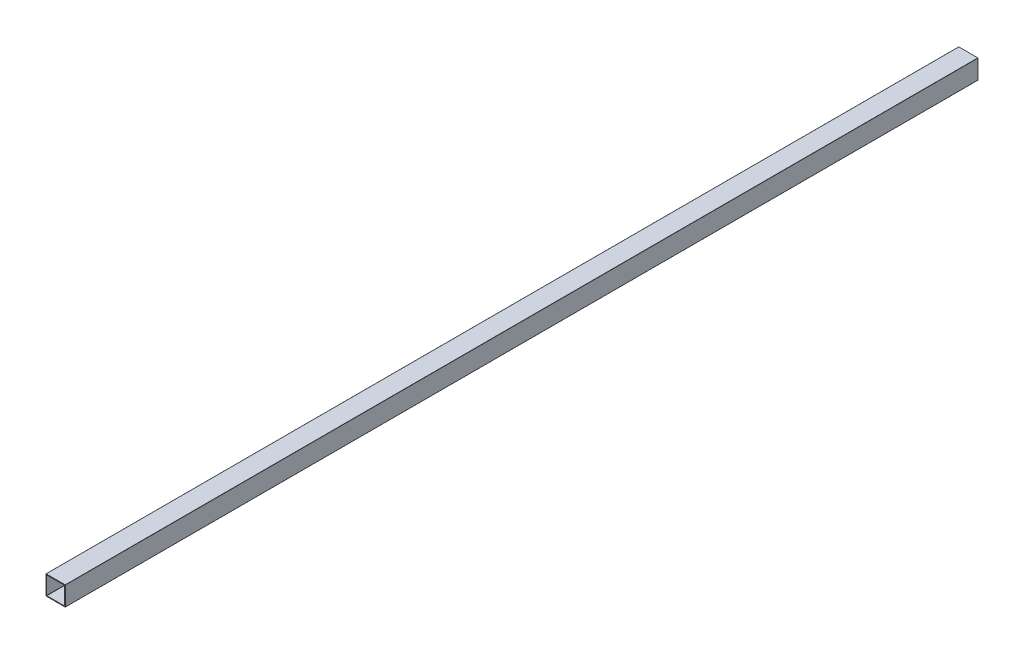
ISO-10303-21;
HEADER;
FILE_DESCRIPTION(('STEP AP214'),'2;1');
FILE_NAME('part.step','',(''),(''),'','','');
FILE_SCHEMA(('AUTOMOTIVE_DESIGN { 1 0 10303 214 1 1 1 1 }'));
ENDSEC;
DATA;
#1=APPLICATION_CONTEXT('core data for automotive mechanical design processes');
#2=APPLICATION_PROTOCOL_DEFINITION('international standard','automotive_design',2000,#1);
#3=PRODUCT_CONTEXT('',#1,'mechanical');
#4=PRODUCT('Part','Part','',(#3));
#5=PRODUCT_RELATED_PRODUCT_CATEGORY('part','',(#4));
#6=PRODUCT_DEFINITION_FORMATION('','',#4);
#7=PRODUCT_DEFINITION_CONTEXT('part definition',#1,'design');
#8=PRODUCT_DEFINITION('design','',#6,#7);
#9=PRODUCT_DEFINITION_SHAPE('','',#8);
#10=(LENGTH_UNIT() NAMED_UNIT(*) SI_UNIT(.MILLI.,.METRE.));
#11=(NAMED_UNIT(*) PLANE_ANGLE_UNIT() SI_UNIT($,.RADIAN.));
#12=(NAMED_UNIT(*) SI_UNIT($,.STERADIAN.) SOLID_ANGLE_UNIT());
#13=UNCERTAINTY_MEASURE_WITH_UNIT(LENGTH_MEASURE(1.E-05),#10,'distance_accuracy_value','');
#14=(GEOMETRIC_REPRESENTATION_CONTEXT(3) GLOBAL_UNCERTAINTY_ASSIGNED_CONTEXT((#13)) GLOBAL_UNIT_ASSIGNED_CONTEXT((#10,
#11,#12)) REPRESENTATION_CONTEXT('',''));
#15=CARTESIAN_POINT('',(0.,0.,0.));
#16=DIRECTION('',(0.,0.,1.));
#17=DIRECTION('',(1.,0.,0.));
#18=AXIS2_PLACEMENT_3D('',#15,#16,#17);
#19=CARTESIAN_POINT('',(63.5,-63.5,-6000.));
#20=DIRECTION('',(1.,0.,0.));
#21=DIRECTION('',(0.,0.,-1.));
#22=AXIS2_PLACEMENT_3D('',#19,#20,#21);
#23=PLANE('',#22);
#24=DIRECTION('',(0.,1.,0.));
#25=VECTOR('',#24,1.);
#26=CARTESIAN_POINT('',(63.5,-63.5,0.));
#27=LINE('',#26,#25);
#28=CARTESIAN_POINT('',(63.5,-62.5,0.));
#29=VERTEX_POINT('',#28);
#30=CARTESIAN_POINT('',(63.5,62.5,0.));
#31=VERTEX_POINT('',#30);
#32=EDGE_CURVE('E197',#29,#31,#27,.T.);
#33=ORIENTED_EDGE('',*,*,#32,.F.);
#34=DIRECTION('',(0.,0.,1.));
#35=VECTOR('',#34,1.);
#36=CARTESIAN_POINT('',(63.5,-62.5,-6000.));
#37=LINE('',#36,#35);
#38=CARTESIAN_POINT('',(63.5,-62.5,-6000.));
#39=VERTEX_POINT('',#38);
#40=EDGE_CURVE('E158',#29,#39,#37,.F.);
#41=ORIENTED_EDGE('',*,*,#40,.T.);
#42=DIRECTION('',(0.,1.,0.));
#43=VECTOR('',#42,1.);
#44=CARTESIAN_POINT('',(63.5,-63.5,-6000.));
#45=LINE('',#44,#43);
#46=CARTESIAN_POINT('',(63.5,62.5,-6000.));
#47=VERTEX_POINT('',#46);
#48=EDGE_CURVE('E185',#39,#47,#45,.T.);
#49=ORIENTED_EDGE('',*,*,#48,.T.);
#50=DIRECTION('',(0.,0.,1.));
#51=VECTOR('',#50,1.);
#52=CARTESIAN_POINT('',(63.5,62.5,-6000.));
#53=LINE('',#52,#51);
#54=EDGE_CURVE('E251',#47,#31,#53,.T.);
#55=ORIENTED_EDGE('',*,*,#54,.T.);
#56=EDGE_LOOP('',(#33,#41,#49,#55));
#57=FACE_BOUND('',#56,.T.);
#58=ADVANCED_FACE('F33',(#57),#23,.T.);
#59=CARTESIAN_POINT('',(-63.5,-63.5,-6000.));
#60=DIRECTION('',(0.,-1.,0.));
#61=DIRECTION('',(0.,0.,-1.));
#62=AXIS2_PLACEMENT_3D('',#59,#60,#61);
#63=PLANE('',#62);
#64=DIRECTION('',(1.,0.,0.));
#65=VECTOR('',#64,1.);
#66=CARTESIAN_POINT('',(-63.5,-63.5,0.));
#67=LINE('',#66,#65);
#68=CARTESIAN_POINT('',(-62.5,-63.5,0.));
#69=VERTEX_POINT('',#68);
#70=CARTESIAN_POINT('',(62.5,-63.5,0.));
#71=VERTEX_POINT('',#70);
#72=EDGE_CURVE('E189',#69,#71,#67,.T.);
#73=ORIENTED_EDGE('',*,*,#72,.F.);
#74=DIRECTION('',(0.,0.,1.));
#75=VECTOR('',#74,1.);
#76=CARTESIAN_POINT('',(-62.5,-63.5,-6000.));
#77=LINE('',#76,#75);
#78=CARTESIAN_POINT('',(-62.5,-63.5,-6000.));
#79=VERTEX_POINT('',#78);
#80=EDGE_CURVE('E238',#69,#79,#77,.F.);
#81=ORIENTED_EDGE('',*,*,#80,.T.);
#82=DIRECTION('',(1.,0.,0.));
#83=VECTOR('',#82,1.);
#84=CARTESIAN_POINT('',(-63.5,-63.5,-6000.));
#85=LINE('',#84,#83);
#86=CARTESIAN_POINT('',(62.5,-63.5,-6000.));
#87=VERTEX_POINT('',#86);
#88=EDGE_CURVE('E194',#79,#87,#85,.T.);
#89=ORIENTED_EDGE('',*,*,#88,.T.);
#90=DIRECTION('',(0.,0.,1.));
#91=VECTOR('',#90,1.);
#92=CARTESIAN_POINT('',(62.5,-63.5,-6000.));
#93=LINE('',#92,#91);
#94=EDGE_CURVE('E235',#87,#71,#93,.T.);
#95=ORIENTED_EDGE('',*,*,#94,.T.);
#96=EDGE_LOOP('',(#73,#81,#89,#95));
#97=FACE_BOUND('',#96,.T.);
#98=ADVANCED_FACE('F305',(#97),#63,.T.);
#99=CARTESIAN_POINT('',(-63.5,-63.5,-6000.));
#100=DIRECTION('',(-1.,0.,0.));
#101=DIRECTION('',(0.,0.,1.));
#102=AXIS2_PLACEMENT_3D('',#99,#100,#101);
#103=PLANE('',#102);
#104=DIRECTION('',(0.,-1.,0.));
#105=VECTOR('',#104,1.);
#106=CARTESIAN_POINT('',(-63.5,-63.5,-6000.));
#107=LINE('',#106,#105);
#108=CARTESIAN_POINT('',(-63.5,62.5,-6000.));
#109=VERTEX_POINT('',#108);
#110=CARTESIAN_POINT('',(-63.5,-62.5,-6000.));
#111=VERTEX_POINT('',#110);
#112=EDGE_CURVE('E191',#109,#111,#107,.T.);
#113=ORIENTED_EDGE('',*,*,#112,.T.);
#114=DIRECTION('',(0.,0.,1.));
#115=VECTOR('',#114,1.);
#116=CARTESIAN_POINT('',(-63.5,-62.5,-6000.));
#117=LINE('',#116,#115);
#118=CARTESIAN_POINT('',(-63.5,-62.5,0.));
#119=VERTEX_POINT('',#118);
#120=EDGE_CURVE('E224',#111,#119,#117,.T.);
#121=ORIENTED_EDGE('',*,*,#120,.T.);
#122=DIRECTION('',(0.,-1.,0.));
#123=VECTOR('',#122,1.);
#124=CARTESIAN_POINT('',(-63.5,-63.5,0.));
#125=LINE('',#124,#123);
#126=CARTESIAN_POINT('',(-63.5,62.5,0.));
#127=VERTEX_POINT('',#126);
#128=EDGE_CURVE('E203',#127,#119,#125,.T.);
#129=ORIENTED_EDGE('',*,*,#128,.F.);
#130=DIRECTION('',(0.,0.,1.));
#131=VECTOR('',#130,1.);
#132=CARTESIAN_POINT('',(-63.5,62.5,-6000.));
#133=LINE('',#132,#131);
#134=EDGE_CURVE('E222',#127,#109,#133,.F.);
#135=ORIENTED_EDGE('',*,*,#134,.T.);
#136=EDGE_LOOP('',(#113,#121,#129,#135));
#137=FACE_BOUND('',#136,.T.);
#138=ADVANCED_FACE('F311',(#137),#103,.T.);
#139=CARTESIAN_POINT('',(-63.5,63.5,-6000.));
#140=DIRECTION('',(0.,1.,0.));
#141=DIRECTION('',(0.,0.,1.));
#142=AXIS2_PLACEMENT_3D('',#139,#140,#141);
#143=PLANE('',#142);
#144=DIRECTION('',(-1.,0.,0.));
#145=VECTOR('',#144,1.);
#146=CARTESIAN_POINT('',(-63.5,63.5,-6000.));
#147=LINE('',#146,#145);
#148=CARTESIAN_POINT('',(62.5,63.5,-6000.));
#149=VERTEX_POINT('',#148);
#150=CARTESIAN_POINT('',(-62.5,63.5,-6000.));
#151=VERTEX_POINT('',#150);
#152=EDGE_CURVE('E188',#149,#151,#147,.T.);
#153=ORIENTED_EDGE('',*,*,#152,.T.);
#154=DIRECTION('',(0.,0.,1.));
#155=VECTOR('',#154,1.);
#156=CARTESIAN_POINT('',(-62.5,63.5,-6000.));
#157=LINE('',#156,#155);
#158=CARTESIAN_POINT('',(-62.5,63.5,0.));
#159=VERTEX_POINT('',#158);
#160=EDGE_CURVE('E248',#151,#159,#157,.T.);
#161=ORIENTED_EDGE('',*,*,#160,.T.);
#162=DIRECTION('',(-1.,0.,0.));
#163=VECTOR('',#162,1.);
#164=CARTESIAN_POINT('',(-63.5,63.5,0.));
#165=LINE('',#164,#163);
#166=CARTESIAN_POINT('',(62.5,63.5,0.));
#167=VERTEX_POINT('',#166);
#168=EDGE_CURVE('E200',#167,#159,#165,.T.);
#169=ORIENTED_EDGE('',*,*,#168,.F.);
#170=DIRECTION('',(0.,0.,1.));
#171=VECTOR('',#170,1.);
#172=CARTESIAN_POINT('',(62.5,63.5,-6000.));
#173=LINE('',#172,#171);
#174=EDGE_CURVE('E55',#167,#149,#173,.F.);
#175=ORIENTED_EDGE('',*,*,#174,.T.);
#176=EDGE_LOOP('',(#153,#161,#169,#175));
#177=FACE_BOUND('',#176,.T.);
#178=ADVANCED_FACE('F316',(#177),#143,.T.);
#179=CARTESIAN_POINT('',(0.,0.,-6000.));
#180=DIRECTION('',(0.,0.,-1.));
#181=DIRECTION('',(-1.,0.,0.));
#182=AXIS2_PLACEMENT_3D('',#179,#180,#181);
#183=PLANE('',#182);
#184=DIRECTION('',(0.,-1.,0.));
#185=VECTOR('',#184,1.);
#186=CARTESIAN_POINT('',(-58.95,-58.95,-6000.));
#187=LINE('',#186,#185);
#188=CARTESIAN_POINT('',(-58.95,57.95,-6000.));
#189=VERTEX_POINT('',#188);
#190=CARTESIAN_POINT('',(-58.95,-57.95,-6000.));
#191=VERTEX_POINT('',#190);
#192=EDGE_CURVE('E167',#189,#191,#187,.T.);
#193=ORIENTED_EDGE('',*,*,#192,.T.);
#194=CARTESIAN_POINT('',(-57.95,-57.95,-6000.));
#195=DIRECTION('',(0.,0.,-1.));
#196=DIRECTION('',(-1.,0.,0.));
#197=AXIS2_PLACEMENT_3D('',#194,#195,#196);
#198=CIRCLE('',#197,1.);
#199=CARTESIAN_POINT('',(-57.95,-58.95,-6000.));
#200=VERTEX_POINT('',#199);
#201=EDGE_CURVE('E11',#191,#200,#198,.F.);
#202=ORIENTED_EDGE('',*,*,#201,.T.);
#203=DIRECTION('',(1.,0.,0.));
#204=VECTOR('',#203,1.);
#205=CARTESIAN_POINT('',(-58.95,-58.95,-6000.));
#206=LINE('',#205,#204);
#207=CARTESIAN_POINT('',(57.95,-58.95,-6000.));
#208=VERTEX_POINT('',#207);
#209=EDGE_CURVE('E175',#200,#208,#206,.T.);
#210=ORIENTED_EDGE('',*,*,#209,.T.);
#211=CARTESIAN_POINT('',(57.95,-57.95,-6000.));
#212=DIRECTION('',(0.,0.,-1.));
#213=DIRECTION('',(-1.,0.,0.));
#214=AXIS2_PLACEMENT_3D('',#211,#212,#213);
#215=CIRCLE('',#214,1.);
#216=CARTESIAN_POINT('',(58.95,-57.95,-6000.));
#217=VERTEX_POINT('',#216);
#218=EDGE_CURVE('E262',#208,#217,#215,.F.);
#219=ORIENTED_EDGE('',*,*,#218,.T.);
#220=DIRECTION('',(0.,1.,0.));
#221=VECTOR('',#220,1.);
#222=CARTESIAN_POINT('',(58.95,-58.95,-6000.));
#223=LINE('',#222,#221);
#224=CARTESIAN_POINT('',(58.95,57.95,-6000.));
#225=VERTEX_POINT('',#224);
#226=EDGE_CURVE('E179',#217,#225,#223,.T.);
#227=ORIENTED_EDGE('',*,*,#226,.T.);
#228=CARTESIAN_POINT('',(57.95,57.95,-6000.));
#229=DIRECTION('',(0.,0.,-1.));
#230=DIRECTION('',(-1.,0.,0.));
#231=AXIS2_PLACEMENT_3D('',#228,#229,#230);
#232=CIRCLE('',#231,1.);
#233=CARTESIAN_POINT('',(57.95,58.95,-6000.));
#234=VERTEX_POINT('',#233);
#235=EDGE_CURVE('E258',#225,#234,#232,.F.);
#236=ORIENTED_EDGE('',*,*,#235,.T.);
#237=DIRECTION('',(-1.,0.,0.));
#238=VECTOR('',#237,1.);
#239=CARTESIAN_POINT('',(-58.95,58.95,-6000.));
#240=LINE('',#239,#238);
#241=CARTESIAN_POINT('',(-57.95,58.95,-6000.));
#242=VERTEX_POINT('',#241);
#243=EDGE_CURVE('E277',#234,#242,#240,.T.);
#244=ORIENTED_EDGE('',*,*,#243,.T.);
#245=CARTESIAN_POINT('',(-57.95,57.95,-6000.));
#246=DIRECTION('',(0.,0.,-1.));
#247=DIRECTION('',(-1.,0.,0.));
#248=AXIS2_PLACEMENT_3D('',#245,#246,#247);
#249=CIRCLE('',#248,1.);
#250=EDGE_CURVE('E157',#242,#189,#249,.F.);
#251=ORIENTED_EDGE('',*,*,#250,.T.);
#252=EDGE_LOOP('',(#193,#202,#210,#219,#227,#236,#244,#251));
#253=FACE_BOUND('',#252,.T.);
#254=ORIENTED_EDGE('',*,*,#88,.F.);
#255=CARTESIAN_POINT('',(-62.5,-62.5,-6000.));
#256=DIRECTION('',(0.,0.,-1.));
#257=DIRECTION('',(-1.,0.,0.));
#258=AXIS2_PLACEMENT_3D('',#255,#256,#257);
#259=CIRCLE('',#258,1.);
#260=EDGE_CURVE('E245',#79,#111,#259,.T.);
#261=ORIENTED_EDGE('',*,*,#260,.T.);
#262=ORIENTED_EDGE('',*,*,#112,.F.);
#263=CARTESIAN_POINT('',(-62.5,62.5,-6000.));
#264=DIRECTION('',(0.,0.,-1.));
#265=DIRECTION('',(-1.,0.,0.));
#266=AXIS2_PLACEMENT_3D('',#263,#264,#265);
#267=CIRCLE('',#266,1.);
#268=EDGE_CURVE('E48',#109,#151,#267,.T.);
#269=ORIENTED_EDGE('',*,*,#268,.T.);
#270=ORIENTED_EDGE('',*,*,#152,.F.);
#271=CARTESIAN_POINT('',(62.5,62.5,-6000.));
#272=DIRECTION('',(0.,0.,-1.));
#273=DIRECTION('',(-1.,0.,0.));
#274=AXIS2_PLACEMENT_3D('',#271,#272,#273);
#275=CIRCLE('',#274,1.);
#276=EDGE_CURVE('E240',#149,#47,#275,.T.);
#277=ORIENTED_EDGE('',*,*,#276,.T.);
#278=ORIENTED_EDGE('',*,*,#48,.F.);
#279=CARTESIAN_POINT('',(62.5,-62.5,-6000.));
#280=DIRECTION('',(0.,0.,-1.));
#281=DIRECTION('',(-1.,0.,0.));
#282=AXIS2_PLACEMENT_3D('',#279,#280,#281);
#283=CIRCLE('',#282,1.);
#284=EDGE_CURVE('E242',#39,#87,#283,.T.);
#285=ORIENTED_EDGE('',*,*,#284,.T.);
#286=EDGE_LOOP('',(#254,#261,#262,#269,#270,#277,#278,#285));
#287=FACE_BOUND('',#286,.T.);
#288=ADVANCED_FACE('F267',(#253,#287),#183,.T.);
#289=CARTESIAN_POINT('',(0.,0.,0.));
#290=DIRECTION('',(0.,0.,-1.));
#291=DIRECTION('',(-1.,0.,0.));
#292=AXIS2_PLACEMENT_3D('',#289,#290,#291);
#293=PLANE('',#292);
#294=DIRECTION('',(0.,1.,0.));
#295=VECTOR('',#294,1.);
#296=CARTESIAN_POINT('',(58.95,-58.95,0.));
#297=LINE('',#296,#295);
#298=CARTESIAN_POINT('',(58.95,-57.95,0.));
#299=VERTEX_POINT('',#298);
#300=CARTESIAN_POINT('',(58.95,57.95,0.));
#301=VERTEX_POINT('',#300);
#302=EDGE_CURVE('E181',#299,#301,#297,.T.);
#303=ORIENTED_EDGE('',*,*,#302,.F.);
#304=CARTESIAN_POINT('',(57.95,-57.95,0.));
#305=DIRECTION('',(0.,0.,-1.));
#306=DIRECTION('',(-1.,0.,0.));
#307=AXIS2_PLACEMENT_3D('',#304,#305,#306);
#308=CIRCLE('',#307,1.);
#309=CARTESIAN_POINT('',(57.95,-58.95,0.));
#310=VERTEX_POINT('',#309);
#311=EDGE_CURVE('E260',#299,#310,#308,.T.);
#312=ORIENTED_EDGE('',*,*,#311,.T.);
#313=DIRECTION('',(1.,0.,0.));
#314=VECTOR('',#313,1.);
#315=CARTESIAN_POINT('',(-58.95,-58.95,0.));
#316=LINE('',#315,#314);
#317=CARTESIAN_POINT('',(-57.95,-58.95,0.));
#318=VERTEX_POINT('',#317);
#319=EDGE_CURVE('E281',#318,#310,#316,.T.);
#320=ORIENTED_EDGE('',*,*,#319,.F.);
#321=CARTESIAN_POINT('',(-57.95,-57.95,0.));
#322=DIRECTION('',(0.,0.,-1.));
#323=DIRECTION('',(-1.,0.,0.));
#324=AXIS2_PLACEMENT_3D('',#321,#322,#323);
#325=CIRCLE('',#324,1.);
#326=CARTESIAN_POINT('',(-58.95,-57.95,0.));
#327=VERTEX_POINT('',#326);
#328=EDGE_CURVE('E41',#318,#327,#325,.T.);
#329=ORIENTED_EDGE('',*,*,#328,.T.);
#330=DIRECTION('',(0.,-1.,0.));
#331=VECTOR('',#330,1.);
#332=CARTESIAN_POINT('',(-58.95,-58.95,0.));
#333=LINE('',#332,#331);
#334=CARTESIAN_POINT('',(-58.95,57.95,0.));
#335=VERTEX_POINT('',#334);
#336=EDGE_CURVE('E164',#335,#327,#333,.T.);
#337=ORIENTED_EDGE('',*,*,#336,.F.);
#338=CARTESIAN_POINT('',(-57.95,57.95,0.));
#339=DIRECTION('',(0.,0.,-1.));
#340=DIRECTION('',(-1.,0.,0.));
#341=AXIS2_PLACEMENT_3D('',#338,#339,#340);
#342=CIRCLE('',#341,1.);
#343=CARTESIAN_POINT('',(-57.95,58.95,0.));
#344=VERTEX_POINT('',#343);
#345=EDGE_CURVE('E147',#335,#344,#342,.T.);
#346=ORIENTED_EDGE('',*,*,#345,.T.);
#347=DIRECTION('',(-1.,0.,0.));
#348=VECTOR('',#347,1.);
#349=CARTESIAN_POINT('',(-58.95,58.95,0.));
#350=LINE('',#349,#348);
#351=CARTESIAN_POINT('',(57.95,58.95,0.));
#352=VERTEX_POINT('',#351);
#353=EDGE_CURVE('E176',#352,#344,#350,.T.);
#354=ORIENTED_EDGE('',*,*,#353,.F.);
#355=CARTESIAN_POINT('',(57.95,57.95,0.));
#356=DIRECTION('',(0.,0.,-1.));
#357=DIRECTION('',(-1.,0.,0.));
#358=AXIS2_PLACEMENT_3D('',#355,#356,#357);
#359=CIRCLE('',#358,1.);
#360=EDGE_CURVE('E256',#352,#301,#359,.T.);
#361=ORIENTED_EDGE('',*,*,#360,.T.);
#362=EDGE_LOOP('',(#303,#312,#320,#329,#337,#346,#354,#361));
#363=FACE_BOUND('',#362,.T.);
#364=ORIENTED_EDGE('',*,*,#128,.T.);
#365=CARTESIAN_POINT('',(-62.5,-62.5,0.));
#366=DIRECTION('',(0.,0.,-1.));
#367=DIRECTION('',(-1.,0.,0.));
#368=AXIS2_PLACEMENT_3D('',#365,#366,#367);
#369=CIRCLE('',#368,1.);
#370=EDGE_CURVE('E233',#119,#69,#369,.F.);
#371=ORIENTED_EDGE('',*,*,#370,.T.);
#372=ORIENTED_EDGE('',*,*,#72,.T.);
#373=CARTESIAN_POINT('',(62.5,-62.5,0.));
#374=DIRECTION('',(0.,0.,-1.));
#375=DIRECTION('',(-1.,0.,0.));
#376=AXIS2_PLACEMENT_3D('',#373,#374,#375);
#377=CIRCLE('',#376,1.);
#378=EDGE_CURVE('E229',#71,#29,#377,.F.);
#379=ORIENTED_EDGE('',*,*,#378,.T.);
#380=ORIENTED_EDGE('',*,*,#32,.T.);
#381=CARTESIAN_POINT('',(62.5,62.5,0.));
#382=DIRECTION('',(0.,0.,-1.));
#383=DIRECTION('',(-1.,0.,0.));
#384=AXIS2_PLACEMENT_3D('',#381,#382,#383);
#385=CIRCLE('',#384,1.);
#386=EDGE_CURVE('E227',#31,#167,#385,.F.);
#387=ORIENTED_EDGE('',*,*,#386,.T.);
#388=ORIENTED_EDGE('',*,*,#168,.T.);
#389=CARTESIAN_POINT('',(-62.5,62.5,0.));
#390=DIRECTION('',(0.,0.,-1.));
#391=DIRECTION('',(-1.,0.,0.));
#392=AXIS2_PLACEMENT_3D('',#389,#390,#391);
#393=CIRCLE('',#392,1.);
#394=EDGE_CURVE('E231',#159,#127,#393,.F.);
#395=ORIENTED_EDGE('',*,*,#394,.T.);
#396=EDGE_LOOP('',(#364,#371,#372,#379,#380,#387,#388,#395));
#397=FACE_BOUND('',#396,.T.);
#398=ADVANCED_FACE('F172',(#363,#397),#293,.F.);
#399=CARTESIAN_POINT('',(-58.95,-58.95,-6000.));
#400=DIRECTION('',(0.,-1.,0.));
#401=DIRECTION('',(0.,0.,-1.));
#402=AXIS2_PLACEMENT_3D('',#399,#400,#401);
#403=PLANE('',#402);
#404=ORIENTED_EDGE('',*,*,#319,.T.);
#405=DIRECTION('',(0.,0.,1.));
#406=VECTOR('',#405,1.);
#407=CARTESIAN_POINT('',(57.95,-58.95,-6000.));
#408=LINE('',#407,#406);
#409=EDGE_CURVE('E220',#310,#208,#408,.F.);
#410=ORIENTED_EDGE('',*,*,#409,.T.);
#411=ORIENTED_EDGE('',*,*,#209,.F.);
#412=DIRECTION('',(0.,0.,1.));
#413=VECTOR('',#412,1.);
#414=CARTESIAN_POINT('',(-57.95,-58.95,0.));
#415=LINE('',#414,#413);
#416=EDGE_CURVE('E217',#200,#318,#415,.T.);
#417=ORIENTED_EDGE('',*,*,#416,.T.);
#418=EDGE_LOOP('',(#404,#410,#411,#417));
#419=FACE_BOUND('',#418,.T.);
#420=ADVANCED_FACE('F283',(#419),#403,.F.);
#421=CARTESIAN_POINT('',(-58.95,-58.95,-6000.));
#422=DIRECTION('',(-1.,0.,0.));
#423=DIRECTION('',(0.,0.,1.));
#424=AXIS2_PLACEMENT_3D('',#421,#422,#423);
#425=PLANE('',#424);
#426=ORIENTED_EDGE('',*,*,#192,.F.);
#427=DIRECTION('',(0.,0.,1.));
#428=VECTOR('',#427,1.);
#429=CARTESIAN_POINT('',(-58.95,57.95,0.));
#430=LINE('',#429,#428);
#431=EDGE_CURVE('E151',#189,#335,#430,.T.);
#432=ORIENTED_EDGE('',*,*,#431,.T.);
#433=ORIENTED_EDGE('',*,*,#336,.T.);
#434=DIRECTION('',(0.,0.,1.));
#435=VECTOR('',#434,1.);
#436=CARTESIAN_POINT('',(-58.95,-57.95,-6000.));
#437=LINE('',#436,#435);
#438=EDGE_CURVE('E169',#327,#191,#437,.F.);
#439=ORIENTED_EDGE('',*,*,#438,.T.);
#440=EDGE_LOOP('',(#426,#432,#433,#439));
#441=FACE_BOUND('',#440,.T.);
#442=ADVANCED_FACE('F163',(#441),#425,.F.);
#443=CARTESIAN_POINT('',(-58.95,58.95,-6000.));
#444=DIRECTION('',(0.,1.,0.));
#445=DIRECTION('',(0.,0.,1.));
#446=AXIS2_PLACEMENT_3D('',#443,#444,#445);
#447=PLANE('',#446);
#448=ORIENTED_EDGE('',*,*,#353,.T.);
#449=DIRECTION('',(0.,0.,1.));
#450=VECTOR('',#449,1.);
#451=CARTESIAN_POINT('',(-57.95,58.95,-6000.));
#452=LINE('',#451,#450);
#453=EDGE_CURVE('E152',#344,#242,#452,.F.);
#454=ORIENTED_EDGE('',*,*,#453,.T.);
#455=ORIENTED_EDGE('',*,*,#243,.F.);
#456=DIRECTION('',(0.,0.,1.));
#457=VECTOR('',#456,1.);
#458=CARTESIAN_POINT('',(57.95,58.95,0.));
#459=LINE('',#458,#457);
#460=EDGE_CURVE('E168',#234,#352,#459,.T.);
#461=ORIENTED_EDGE('',*,*,#460,.T.);
#462=EDGE_LOOP('',(#448,#454,#455,#461));
#463=FACE_BOUND('',#462,.T.);
#464=ADVANCED_FACE('F292',(#463),#447,.F.);
#465=CARTESIAN_POINT('',(58.95,-58.95,-6000.));
#466=DIRECTION('',(1.,0.,0.));
#467=DIRECTION('',(0.,0.,-1.));
#468=AXIS2_PLACEMENT_3D('',#465,#466,#467);
#469=PLANE('',#468);
#470=ORIENTED_EDGE('',*,*,#302,.T.);
#471=DIRECTION('',(0.,0.,1.));
#472=VECTOR('',#471,1.);
#473=CARTESIAN_POINT('',(58.95,57.95,-6000.));
#474=LINE('',#473,#472);
#475=EDGE_CURVE('E215',#301,#225,#474,.F.);
#476=ORIENTED_EDGE('',*,*,#475,.T.);
#477=ORIENTED_EDGE('',*,*,#226,.F.);
#478=DIRECTION('',(0.,0.,1.));
#479=VECTOR('',#478,1.);
#480=CARTESIAN_POINT('',(58.95,-57.95,0.));
#481=LINE('',#480,#479);
#482=EDGE_CURVE('E212',#217,#299,#481,.T.);
#483=ORIENTED_EDGE('',*,*,#482,.T.);
#484=EDGE_LOOP('',(#470,#476,#477,#483));
#485=FACE_BOUND('',#484,.T.);
#486=ADVANCED_FACE('F275',(#485),#469,.F.);
#487=CARTESIAN_POINT('',(-57.95,57.95,-6000.));
#488=DIRECTION('',(0.,0.,-1.));
#489=DIRECTION('',(-1.,0.,0.));
#490=AXIS2_PLACEMENT_3D('',#487,#488,#489);
#491=CYLINDRICAL_SURFACE('',#490,1.);
#492=ORIENTED_EDGE('',*,*,#250,.F.);
#493=ORIENTED_EDGE('',*,*,#453,.F.);
#494=ORIENTED_EDGE('',*,*,#345,.F.);
#495=ORIENTED_EDGE('',*,*,#431,.F.);
#496=EDGE_LOOP('',(#492,#493,#494,#495));
#497=FACE_BOUND('',#496,.T.);
#498=ADVANCED_FACE('F150',(#497),#491,.F.);
#499=CARTESIAN_POINT('',(57.95,57.95,-6000.));
#500=DIRECTION('',(0.,0.,-1.));
#501=DIRECTION('',(-1.,0.,0.));
#502=AXIS2_PLACEMENT_3D('',#499,#500,#501);
#503=CYLINDRICAL_SURFACE('',#502,1.);
#504=ORIENTED_EDGE('',*,*,#235,.F.);
#505=ORIENTED_EDGE('',*,*,#475,.F.);
#506=ORIENTED_EDGE('',*,*,#360,.F.);
#507=ORIENTED_EDGE('',*,*,#460,.F.);
#508=EDGE_LOOP('',(#504,#505,#506,#507));
#509=FACE_BOUND('',#508,.T.);
#510=ADVANCED_FACE('F294',(#509),#503,.F.);
#511=CARTESIAN_POINT('',(57.95,-57.95,-6000.));
#512=DIRECTION('',(0.,0.,-1.));
#513=DIRECTION('',(-1.,0.,0.));
#514=AXIS2_PLACEMENT_3D('',#511,#512,#513);
#515=CYLINDRICAL_SURFACE('',#514,1.);
#516=ORIENTED_EDGE('',*,*,#218,.F.);
#517=ORIENTED_EDGE('',*,*,#409,.F.);
#518=ORIENTED_EDGE('',*,*,#311,.F.);
#519=ORIENTED_EDGE('',*,*,#482,.F.);
#520=EDGE_LOOP('',(#516,#517,#518,#519));
#521=FACE_BOUND('',#520,.T.);
#522=ADVANCED_FACE('F279',(#521),#515,.F.);
#523=CARTESIAN_POINT('',(-62.5,-62.5,-6000.));
#524=DIRECTION('',(0.,0.,1.));
#525=DIRECTION('',(1.,0.,0.));
#526=AXIS2_PLACEMENT_3D('',#523,#524,#525);
#527=CYLINDRICAL_SURFACE('',#526,1.);
#528=ORIENTED_EDGE('',*,*,#260,.F.);
#529=ORIENTED_EDGE('',*,*,#80,.F.);
#530=ORIENTED_EDGE('',*,*,#370,.F.);
#531=ORIENTED_EDGE('',*,*,#120,.F.);
#532=EDGE_LOOP('',(#528,#529,#530,#531));
#533=FACE_BOUND('',#532,.T.);
#534=ADVANCED_FACE('F301',(#533),#527,.T.);
#535=CARTESIAN_POINT('',(-62.5,62.5,-6000.));
#536=DIRECTION('',(0.,0.,1.));
#537=DIRECTION('',(1.,0.,0.));
#538=AXIS2_PLACEMENT_3D('',#535,#536,#537);
#539=CYLINDRICAL_SURFACE('',#538,1.);
#540=ORIENTED_EDGE('',*,*,#268,.F.);
#541=ORIENTED_EDGE('',*,*,#134,.F.);
#542=ORIENTED_EDGE('',*,*,#394,.F.);
#543=ORIENTED_EDGE('',*,*,#160,.F.);
#544=EDGE_LOOP('',(#540,#541,#542,#543));
#545=FACE_BOUND('',#544,.T.);
#546=ADVANCED_FACE('F368',(#545),#539,.T.);
#547=CARTESIAN_POINT('',(-57.95,-57.95,-6000.));
#548=DIRECTION('',(0.,0.,-1.));
#549=DIRECTION('',(-1.,0.,0.));
#550=AXIS2_PLACEMENT_3D('',#547,#548,#549);
#551=CYLINDRICAL_SURFACE('',#550,1.);
#552=ORIENTED_EDGE('',*,*,#201,.F.);
#553=ORIENTED_EDGE('',*,*,#438,.F.);
#554=ORIENTED_EDGE('',*,*,#328,.F.);
#555=ORIENTED_EDGE('',*,*,#416,.F.);
#556=EDGE_LOOP('',(#552,#553,#554,#555));
#557=FACE_BOUND('',#556,.T.);
#558=ADVANCED_FACE('F378',(#557),#551,.F.);
#559=CARTESIAN_POINT('',(62.5,-62.5,-6000.));
#560=DIRECTION('',(0.,0.,1.));
#561=DIRECTION('',(1.,0.,0.));
#562=AXIS2_PLACEMENT_3D('',#559,#560,#561);
#563=CYLINDRICAL_SURFACE('',#562,1.);
#564=ORIENTED_EDGE('',*,*,#284,.F.);
#565=ORIENTED_EDGE('',*,*,#40,.F.);
#566=ORIENTED_EDGE('',*,*,#378,.F.);
#567=ORIENTED_EDGE('',*,*,#94,.F.);
#568=EDGE_LOOP('',(#564,#565,#566,#567));
#569=FACE_BOUND('',#568,.T.);
#570=ADVANCED_FACE('F388',(#569),#563,.T.);
#571=CARTESIAN_POINT('',(62.5,62.5,-6000.));
#572=DIRECTION('',(0.,0.,1.));
#573=DIRECTION('',(1.,0.,0.));
#574=AXIS2_PLACEMENT_3D('',#571,#572,#573);
#575=CYLINDRICAL_SURFACE('',#574,1.);
#576=ORIENTED_EDGE('',*,*,#276,.F.);
#577=ORIENTED_EDGE('',*,*,#174,.F.);
#578=ORIENTED_EDGE('',*,*,#386,.F.);
#579=ORIENTED_EDGE('',*,*,#54,.F.);
#580=EDGE_LOOP('',(#576,#577,#578,#579));
#581=FACE_BOUND('',#580,.T.);
#582=ADVANCED_FACE('F35',(#581),#575,.T.);
#583=CLOSED_SHELL('',(#58,#98,#138,#178,#288,#398,#420,#442,#464,#486,#498,#510,#522,#534,#546,
#558,#570,#582));
#584=MANIFOLD_SOLID_BREP('B2',#583);
#585=ADVANCED_BREP_SHAPE_REPRESENTATION('',(#18,#584),#14);
#586=SHAPE_DEFINITION_REPRESENTATION(#9,#585);
ENDSEC;
END-ISO-10303-21;
